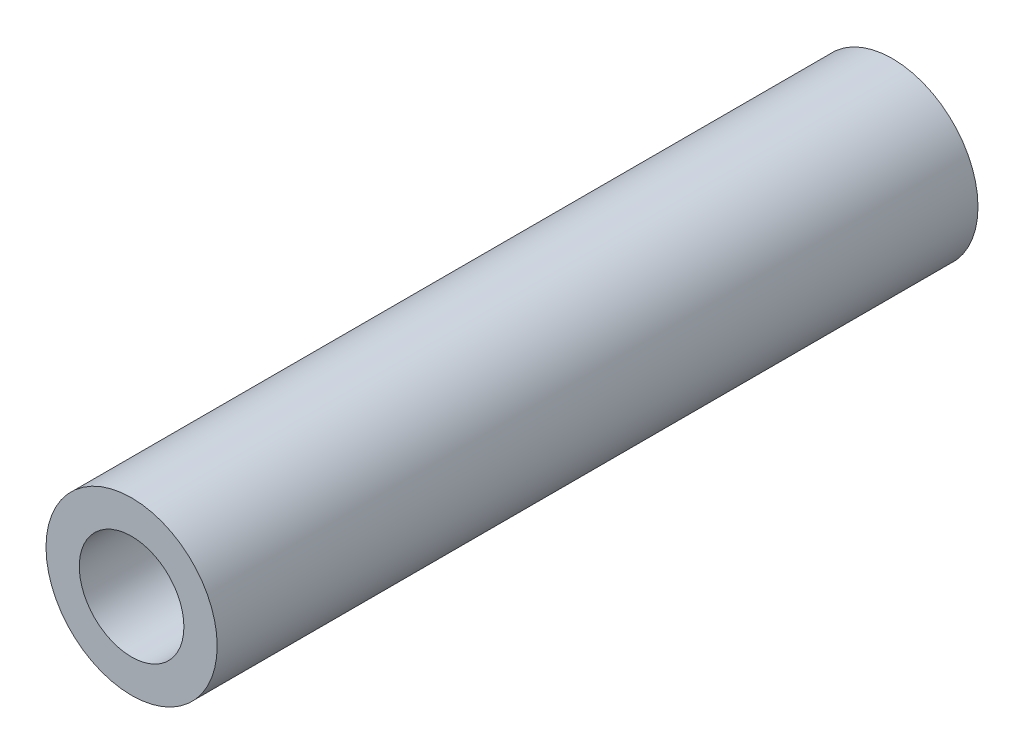
ISO-10303-21;
HEADER;
FILE_DESCRIPTION(('STEP AP214'),'2;1');
FILE_NAME('part.step','',(''),(''),'','','');
FILE_SCHEMA(('AUTOMOTIVE_DESIGN { 1 0 10303 214 1 1 1 1 }'));
ENDSEC;
DATA;
#1=APPLICATION_CONTEXT('core data for automotive mechanical design processes');
#2=APPLICATION_PROTOCOL_DEFINITION('international standard','automotive_design',2000,#1);
#3=PRODUCT_CONTEXT('',#1,'mechanical');
#4=PRODUCT('Part','Part','',(#3));
#5=PRODUCT_RELATED_PRODUCT_CATEGORY('part','',(#4));
#6=PRODUCT_DEFINITION_FORMATION('','',#4);
#7=PRODUCT_DEFINITION_CONTEXT('part definition',#1,'design');
#8=PRODUCT_DEFINITION('design','',#6,#7);
#9=PRODUCT_DEFINITION_SHAPE('','',#8);
#10=(LENGTH_UNIT() NAMED_UNIT(*) SI_UNIT(.MILLI.,.METRE.));
#11=(NAMED_UNIT(*) PLANE_ANGLE_UNIT() SI_UNIT($,.RADIAN.));
#12=(NAMED_UNIT(*) SI_UNIT($,.STERADIAN.) SOLID_ANGLE_UNIT());
#13=UNCERTAINTY_MEASURE_WITH_UNIT(LENGTH_MEASURE(1.E-05),#10,'distance_accuracy_value','');
#14=(GEOMETRIC_REPRESENTATION_CONTEXT(3) GLOBAL_UNCERTAINTY_ASSIGNED_CONTEXT((#13)) GLOBAL_UNIT_ASSIGNED_CONTEXT((#10,
#11,#12)) REPRESENTATION_CONTEXT('',''));
#15=CARTESIAN_POINT('',(0.,0.,0.));
#16=DIRECTION('',(0.,0.,1.));
#17=DIRECTION('',(1.,0.,0.));
#18=AXIS2_PLACEMENT_3D('',#15,#16,#17);
#19=CARTESIAN_POINT('',(0.,0.,16.));
#20=DIRECTION('',(0.,0.,1.));
#21=DIRECTION('',(1.,0.,0.));
#22=AXIS2_PLACEMENT_3D('',#19,#20,#21);
#23=PLANE('',#22);
#24=CARTESIAN_POINT('',(0.,0.,16.));
#25=DIRECTION('',(0.,0.,1.));
#26=DIRECTION('',(1.,0.,0.));
#27=AXIS2_PLACEMENT_3D('',#24,#25,#26);
#28=CIRCLE('',#27,3.6);
#29=CARTESIAN_POINT('',(3.6,0.,16.));
#30=VERTEX_POINT('',#29);
#31=EDGE_CURVE('E10',#30,#30,#28,.T.);
#32=ORIENTED_EDGE('',*,*,#31,.T.);
#33=EDGE_LOOP('',(#32));
#34=FACE_BOUND('',#33,.T.);
#35=CARTESIAN_POINT('',(0.,0.,16.));
#36=DIRECTION('',(0.,0.,1.));
#37=DIRECTION('',(1.,0.,0.));
#38=AXIS2_PLACEMENT_3D('',#35,#36,#37);
#39=CIRCLE('',#38,2.2);
#40=CARTESIAN_POINT('',(2.2,0.,16.));
#41=VERTEX_POINT('',#40);
#42=EDGE_CURVE('E45',#41,#41,#39,.T.);
#43=ORIENTED_EDGE('',*,*,#42,.F.);
#44=EDGE_LOOP('',(#43));
#45=FACE_BOUND('',#44,.T.);
#46=ADVANCED_FACE('F34',(#34,#45),#23,.T.);
#47=CARTESIAN_POINT('',(0.,0.,-16.));
#48=DIRECTION('',(0.,0.,1.));
#49=DIRECTION('',(1.,0.,0.));
#50=AXIS2_PLACEMENT_3D('',#47,#48,#49);
#51=PLANE('',#50);
#52=CARTESIAN_POINT('',(0.,0.,-16.));
#53=DIRECTION('',(0.,0.,1.));
#54=DIRECTION('',(1.,0.,0.));
#55=AXIS2_PLACEMENT_3D('',#52,#53,#54);
#56=CIRCLE('',#55,3.6);
#57=CARTESIAN_POINT('',(3.6,0.,-16.));
#58=VERTEX_POINT('',#57);
#59=EDGE_CURVE('E38',#58,#58,#56,.T.);
#60=ORIENTED_EDGE('',*,*,#59,.F.);
#61=EDGE_LOOP('',(#60));
#62=FACE_BOUND('',#61,.T.);
#63=CARTESIAN_POINT('',(0.,0.,-16.));
#64=DIRECTION('',(0.,0.,1.));
#65=DIRECTION('',(1.,0.,0.));
#66=AXIS2_PLACEMENT_3D('',#63,#64,#65);
#67=CIRCLE('',#66,2.2);
#68=CARTESIAN_POINT('',(2.2,0.,-16.));
#69=VERTEX_POINT('',#68);
#70=EDGE_CURVE('E47',#69,#69,#67,.T.);
#71=ORIENTED_EDGE('',*,*,#70,.T.);
#72=EDGE_LOOP('',(#71));
#73=FACE_BOUND('',#72,.T.);
#74=ADVANCED_FACE('F57',(#62,#73),#51,.F.);
#75=CARTESIAN_POINT('',(0.,0.,16.));
#76=DIRECTION('',(0.,0.,-1.));
#77=DIRECTION('',(-1.,0.,0.));
#78=AXIS2_PLACEMENT_3D('',#75,#76,#77);
#79=CYLINDRICAL_SURFACE('',#78,3.6);
#80=ORIENTED_EDGE('',*,*,#31,.F.);
#81=EDGE_LOOP('',(#80));
#82=FACE_BOUND('',#81,.T.);
#83=ORIENTED_EDGE('',*,*,#59,.T.);
#84=EDGE_LOOP('',(#83));
#85=FACE_BOUND('',#84,.T.);
#86=ADVANCED_FACE('F36',(#82,#85),#79,.T.);
#87=CARTESIAN_POINT('',(0.,0.,16.));
#88=DIRECTION('',(0.,0.,-1.));
#89=DIRECTION('',(-1.,0.,0.));
#90=AXIS2_PLACEMENT_3D('',#87,#88,#89);
#91=CYLINDRICAL_SURFACE('',#90,2.2);
#92=ORIENTED_EDGE('',*,*,#42,.T.);
#93=EDGE_LOOP('',(#92));
#94=FACE_BOUND('',#93,.T.);
#95=ORIENTED_EDGE('',*,*,#70,.F.);
#96=EDGE_LOOP('',(#95));
#97=FACE_BOUND('',#96,.T.);
#98=ADVANCED_FACE('F53',(#94,#97),#91,.F.);
#99=CLOSED_SHELL('',(#46,#74,#86,#98));
#100=MANIFOLD_SOLID_BREP('B2',#99);
#101=ADVANCED_BREP_SHAPE_REPRESENTATION('',(#18,#100),#14);
#102=SHAPE_DEFINITION_REPRESENTATION(#9,#101);
ENDSEC;
END-ISO-10303-21;
